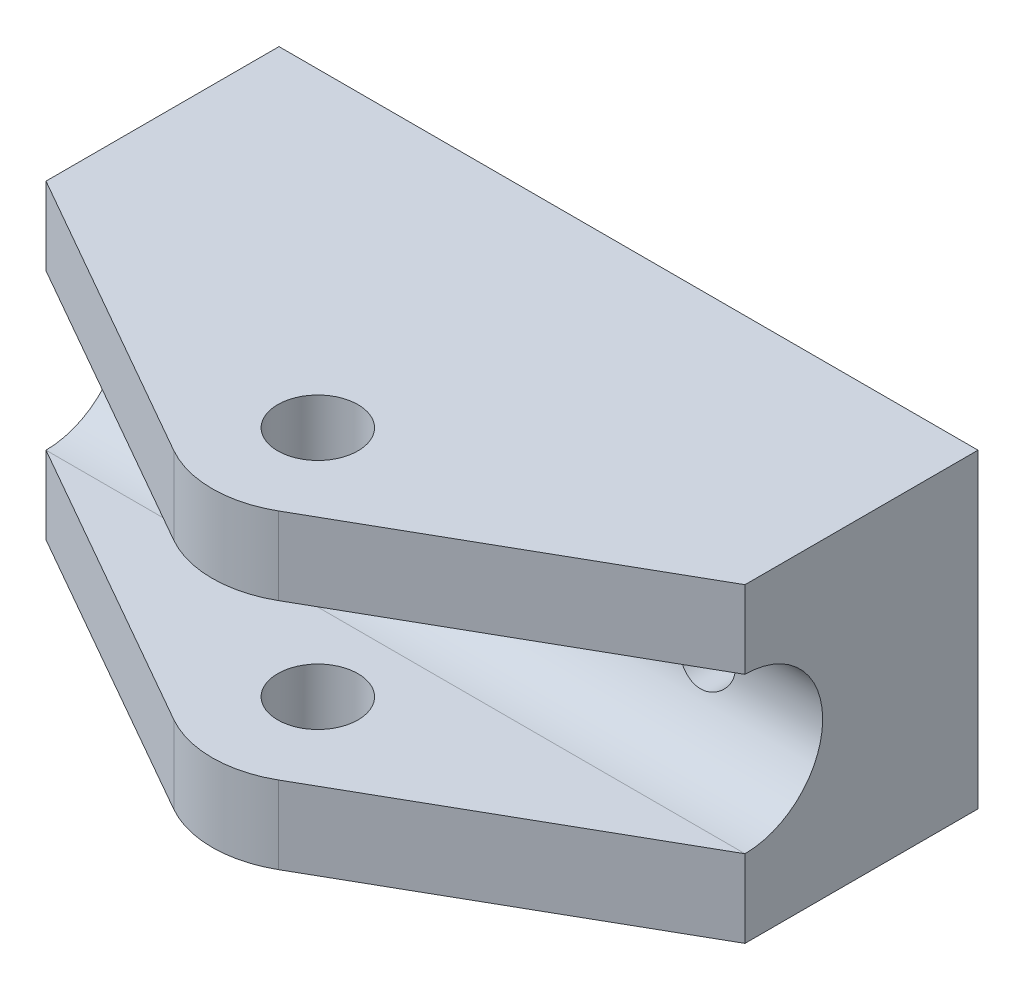
ISO-10303-21;
HEADER;
FILE_DESCRIPTION(('STEP AP214'),'2;1');
FILE_NAME('part.step','',(''),(''),'','','');
FILE_SCHEMA(('AUTOMOTIVE_DESIGN { 1 0 10303 214 1 1 1 1 }'));
ENDSEC;
DATA;
#1=APPLICATION_CONTEXT('core data for automotive mechanical design processes');
#2=APPLICATION_PROTOCOL_DEFINITION('international standard','automotive_design',2000,#1);
#3=PRODUCT_CONTEXT('',#1,'mechanical');
#4=PRODUCT('Part','Part','',(#3));
#5=PRODUCT_RELATED_PRODUCT_CATEGORY('part','',(#4));
#6=PRODUCT_DEFINITION_FORMATION('','',#4);
#7=PRODUCT_DEFINITION_CONTEXT('part definition',#1,'design');
#8=PRODUCT_DEFINITION('design','',#6,#7);
#9=PRODUCT_DEFINITION_SHAPE('','',#8);
#10=(LENGTH_UNIT() NAMED_UNIT(*) SI_UNIT(.MILLI.,.METRE.));
#11=(NAMED_UNIT(*) PLANE_ANGLE_UNIT() SI_UNIT($,.RADIAN.));
#12=(NAMED_UNIT(*) SI_UNIT($,.STERADIAN.) SOLID_ANGLE_UNIT());
#13=UNCERTAINTY_MEASURE_WITH_UNIT(LENGTH_MEASURE(1.E-05),#10,'distance_accuracy_value','');
#14=(GEOMETRIC_REPRESENTATION_CONTEXT(3) GLOBAL_UNCERTAINTY_ASSIGNED_CONTEXT((#13)) GLOBAL_UNIT_ASSIGNED_CONTEXT((#10,
#11,#12)) REPRESENTATION_CONTEXT('',''));
#15=CARTESIAN_POINT('',(0.,0.,0.));
#16=DIRECTION('',(0.,0.,1.));
#17=DIRECTION('',(1.,0.,0.));
#18=AXIS2_PLACEMENT_3D('',#15,#16,#17);
#19=CARTESIAN_POINT('',(226.355780426746,228.6,25.3999999999998));
#20=DIRECTION('',(0.,1.,0.));
#21=DIRECTION('',(-1.,0.,0.));
#22=AXIS2_PLACEMENT_3D('',#19,#20,#21);
#23=CYLINDRICAL_SURFACE('',#22,8.636);
#24=DIRECTION('',(0.,1.,0.));
#25=VECTOR('',#24,1.);
#26=CARTESIAN_POINT('',(222.078587653626,228.6,32.9024074790401));
#27=LINE('',#26,#25);
#28=CARTESIAN_POINT('',(222.078587653626,247.65,32.9024074790389));
#29=VERTEX_POINT('',#28);
#30=CARTESIAN_POINT('',(222.078587653626,254.,32.9024074790401));
#31=VERTEX_POINT('',#30);
#32=EDGE_CURVE('E179',#29,#31,#27,.T.);
#33=ORIENTED_EDGE('',*,*,#32,.F.);
#34=CARTESIAN_POINT('',(226.355780426746,247.65,25.3999999999998));
#35=DIRECTION('',(0.,1.,0.));
#36=DIRECTION('',(-1.,0.,0.));
#37=AXIS2_PLACEMENT_3D('',#34,#35,#36);
#38=CIRCLE('',#37,8.636);
#39=CARTESIAN_POINT('',(230.632973199866,247.65,32.9024074790407));
#40=VERTEX_POINT('',#39);
#41=EDGE_CURVE('E213',#29,#40,#38,.T.);
#42=ORIENTED_EDGE('',*,*,#41,.T.);
#43=DIRECTION('',(0.,1.,0.));
#44=VECTOR('',#43,1.);
#45=CARTESIAN_POINT('',(230.632973199866,228.6,32.9024074790407));
#46=LINE('',#45,#44);
#47=CARTESIAN_POINT('',(230.632973199866,254.,32.9024074790407));
#48=VERTEX_POINT('',#47);
#49=EDGE_CURVE('E181',#40,#48,#46,.T.);
#50=ORIENTED_EDGE('',*,*,#49,.T.);
#51=CARTESIAN_POINT('',(226.355780426746,254.,25.3999999999998));
#52=DIRECTION('',(0.,1.,0.));
#53=DIRECTION('',(0.,0.,1.));
#54=AXIS2_PLACEMENT_3D('',#51,#52,#53);
#55=CIRCLE('',#54,8.636);
#56=EDGE_CURVE('E291',#48,#31,#55,.F.);
#57=ORIENTED_EDGE('',*,*,#56,.T.);
#58=EDGE_LOOP('',(#33,#42,#50,#57));
#59=FACE_BOUND('',#58,.T.);
#60=ADVANCED_FACE('F57',(#59),#23,.T.);
#61=CARTESIAN_POINT('',(70.7302904739295,228.6,124.064424587359));
#62=DIRECTION('',(-0.495274753719334,0.,-0.868736391737018));
#63=DIRECTION('',(-0.868736391737018,0.,0.495274753719334));
#64=AXIS2_PLACEMENT_3D('',#61,#62,#63);
#65=PLANE('',#64);
#66=ORIENTED_EDGE('',*,*,#49,.F.);
#67=DIRECTION('',(0.868736391737018,0.,-0.495274753719334));
#68=VECTOR('',#67,1.);
#69=CARTESIAN_POINT('',(70.7302904739295,247.65,124.064424587359));
#70=LINE('',#69,#68);
#71=CARTESIAN_POINT('',(254.930780426748,247.65,19.049999999999));
#72=VERTEX_POINT('',#71);
#73=EDGE_CURVE('E216',#40,#72,#70,.T.);
#74=ORIENTED_EDGE('',*,*,#73,.T.);
#75=DIRECTION('',(0.,1.,0.));
#76=VECTOR('',#75,1.);
#77=CARTESIAN_POINT('',(254.930780426746,228.6,19.0499999999999));
#78=LINE('',#77,#76);
#79=CARTESIAN_POINT('',(254.930780426746,254.,19.0499999999999));
#80=VERTEX_POINT('',#79);
#81=EDGE_CURVE('E160',#72,#80,#78,.T.);
#82=ORIENTED_EDGE('',*,*,#81,.T.);
#83=DIRECTION('',(-0.868736391737016,0.,0.495274753719333));
#84=VECTOR('',#83,1.);
#85=CARTESIAN_POINT('',(70.7302904739295,254.,124.064424587359));
#86=LINE('',#85,#84);
#87=EDGE_CURVE('E301',#80,#48,#86,.T.);
#88=ORIENTED_EDGE('',*,*,#87,.T.);
#89=EDGE_LOOP('',(#66,#74,#82,#88));
#90=FACE_BOUND('',#89,.T.);
#91=ADVANCED_FACE('F254',(#90),#65,.F.);
#92=CARTESIAN_POINT('',(40.3185342424921,228.6,-70.7207013782029));
#93=DIRECTION('',(-0.495274753719335,0.,0.868736391737017));
#94=DIRECTION('',(0.868736391737017,0.,0.495274753719335));
#95=AXIS2_PLACEMENT_3D('',#92,#93,#94);
#96=PLANE('',#95);
#97=DIRECTION('',(-0.868736391737017,0.,-0.495274753719335));
#98=VECTOR('',#97,1.);
#99=CARTESIAN_POINT('',(40.3185342424921,247.65,-70.7207013782029));
#100=LINE('',#99,#98);
#101=CARTESIAN_POINT('',(197.780780426748,247.65,19.049999999999));
#102=VERTEX_POINT('',#101);
#103=EDGE_CURVE('E211',#29,#102,#100,.T.);
#104=ORIENTED_EDGE('',*,*,#103,.F.);
#105=ORIENTED_EDGE('',*,*,#32,.T.);
#106=DIRECTION('',(0.868736391737016,0.,0.495274753719334));
#107=VECTOR('',#106,1.);
#108=CARTESIAN_POINT('',(40.3185342424921,254.,-70.7207013782029));
#109=LINE('',#108,#107);
#110=CARTESIAN_POINT('',(197.780780426747,254.,19.049999999999));
#111=VERTEX_POINT('',#110);
#112=EDGE_CURVE('E171',#111,#31,#109,.T.);
#113=ORIENTED_EDGE('',*,*,#112,.F.);
#114=DIRECTION('',(0.,1.,0.));
#115=VECTOR('',#114,1.);
#116=CARTESIAN_POINT('',(197.780780426747,228.6,19.049999999999));
#117=LINE('',#116,#115);
#118=EDGE_CURVE('E175',#102,#111,#117,.T.);
#119=ORIENTED_EDGE('',*,*,#118,.F.);
#120=EDGE_LOOP('',(#104,#105,#113,#119));
#121=FACE_BOUND('',#120,.T.);
#122=ADVANCED_FACE('F246',(#121),#96,.T.);
#123=CARTESIAN_POINT('',(226.355780426745,228.6,25.3999999999994));
#124=DIRECTION('',(0.,1.,0.));
#125=DIRECTION('',(-1.,0.,0.));
#126=AXIS2_PLACEMENT_3D('',#123,#124,#125);
#127=CYLINDRICAL_SURFACE('',#126,3.28144717642097);
#128=CARTESIAN_POINT('',(226.355780426745,247.65,25.3999999999994));
#129=DIRECTION('',(0.,1.,0.));
#130=DIRECTION('',(-1.,0.,0.));
#131=AXIS2_PLACEMENT_3D('',#128,#129,#130);
#132=CIRCLE('',#131,3.28144717642097);
#133=CARTESIAN_POINT('',(223.074333250324,247.65,25.3999999999994));
#134=VERTEX_POINT('',#133);
#135=EDGE_CURVE('E62',#134,#134,#132,.F.);
#136=ORIENTED_EDGE('',*,*,#135,.T.);
#137=EDGE_LOOP('',(#136));
#138=FACE_BOUND('',#137,.T.);
#139=CARTESIAN_POINT('',(226.355780426745,254.,25.3999999999994));
#140=DIRECTION('',(0.,1.,0.));
#141=DIRECTION('',(0.,0.,1.));
#142=AXIS2_PLACEMENT_3D('',#139,#140,#141);
#143=CIRCLE('',#142,3.28144717642097);
#144=CARTESIAN_POINT('',(226.355780426745,254.,28.6814471764203));
#145=VERTEX_POINT('',#144);
#146=EDGE_CURVE('E313',#145,#145,#143,.T.);
#147=ORIENTED_EDGE('',*,*,#146,.T.);
#148=EDGE_LOOP('',(#147));
#149=FACE_BOUND('',#148,.T.);
#150=ADVANCED_FACE('F242',(#138,#149),#127,.F.);
#151=CARTESIAN_POINT('',(0.,254.,34.036));
#152=DIRECTION('',(0.,-1.,0.));
#153=DIRECTION('',(1.,0.,0.));
#154=AXIS2_PLACEMENT_3D('',#151,#152,#153);
#155=PLANE('',#154);
#156=ORIENTED_EDGE('',*,*,#56,.F.);
#157=ORIENTED_EDGE('',*,*,#87,.F.);
#158=DIRECTION('',(0.,0.,-1.));
#159=VECTOR('',#158,1.);
#160=CARTESIAN_POINT('',(254.930780426748,254.,34.036));
#161=LINE('',#160,#159);
#162=CARTESIAN_POINT('',(254.930780426748,254.,0.));
#163=VERTEX_POINT('',#162);
#164=EDGE_CURVE('E197',#80,#163,#161,.T.);
#165=ORIENTED_EDGE('',*,*,#164,.T.);
#166=DIRECTION('',(-1.,0.,0.));
#167=VECTOR('',#166,1.);
#168=CARTESIAN_POINT('',(0.,254.,0.));
#169=LINE('',#168,#167);
#170=CARTESIAN_POINT('',(197.780780426748,254.,0.));
#171=VERTEX_POINT('',#170);
#172=EDGE_CURVE('E185',#163,#171,#169,.T.);
#173=ORIENTED_EDGE('',*,*,#172,.T.);
#174=DIRECTION('',(0.,0.,-1.));
#175=VECTOR('',#174,1.);
#176=CARTESIAN_POINT('',(197.780780426748,254.,34.036));
#177=LINE('',#176,#175);
#178=EDGE_CURVE('E12',#111,#171,#177,.T.);
#179=ORIENTED_EDGE('',*,*,#178,.F.);
#180=ORIENTED_EDGE('',*,*,#112,.T.);
#181=EDGE_LOOP('',(#156,#157,#165,#173,#179,#180));
#182=FACE_BOUND('',#181,.T.);
#183=ORIENTED_EDGE('',*,*,#146,.F.);
#184=EDGE_LOOP('',(#183));
#185=FACE_BOUND('',#184,.T.);
#186=ADVANCED_FACE('F268',(#182,#185),#155,.F.);
#187=CARTESIAN_POINT('',(197.780780426748,0.,34.036));
#188=DIRECTION('',(1.,0.,0.));
#189=DIRECTION('',(0.,1.,0.));
#190=AXIS2_PLACEMENT_3D('',#187,#188,#189);
#191=PLANE('',#190);
#192=CARTESIAN_POINT('',(197.780780426747,228.6,19.049999999999));
#193=VERTEX_POINT('',#192);
#194=CARTESIAN_POINT('',(197.780780426747,234.95,19.049999999999));
#195=VERTEX_POINT('',#194);
#196=EDGE_CURVE('E168',#193,#195,#117,.T.);
#197=ORIENTED_EDGE('',*,*,#196,.T.);
#198=CARTESIAN_POINT('',(197.780780426748,241.3,19.049999999999));
#199=DIRECTION('',(-1.,0.,0.));
#200=DIRECTION('',(0.,-1.,0.));
#201=AXIS2_PLACEMENT_3D('',#198,#199,#200);
#202=CIRCLE('',#201,6.34999999999997);
#203=EDGE_CURVE('E75',#102,#195,#202,.T.);
#204=ORIENTED_EDGE('',*,*,#203,.F.);
#205=ORIENTED_EDGE('',*,*,#118,.T.);
#206=ORIENTED_EDGE('',*,*,#178,.T.);
#207=DIRECTION('',(0.,-1.,0.));
#208=VECTOR('',#207,1.);
#209=CARTESIAN_POINT('',(197.780780426748,0.,0.));
#210=LINE('',#209,#208);
#211=CARTESIAN_POINT('',(197.780780426748,228.6,0.));
#212=VERTEX_POINT('',#211);
#213=EDGE_CURVE('E188',#171,#212,#210,.T.);
#214=ORIENTED_EDGE('',*,*,#213,.T.);
#215=DIRECTION('',(0.,0.,-1.));
#216=VECTOR('',#215,1.);
#217=CARTESIAN_POINT('',(197.780780426748,228.6,34.036));
#218=LINE('',#217,#216);
#219=EDGE_CURVE('E67',#193,#212,#218,.T.);
#220=ORIENTED_EDGE('',*,*,#219,.F.);
#221=EDGE_LOOP('',(#197,#204,#205,#206,#214,#220));
#222=FACE_BOUND('',#221,.T.);
#223=ADVANCED_FACE('F264',(#222),#191,.F.);
#224=CARTESIAN_POINT('',(-5.55111512312578E-13,228.6,34.036));
#225=DIRECTION('',(0.,-1.,0.));
#226=DIRECTION('',(1.,0.,0.));
#227=AXIS2_PLACEMENT_3D('',#224,#225,#226);
#228=PLANE('',#227);
#229=DIRECTION('',(-0.868736391737016,0.,0.495274753719333));
#230=VECTOR('',#229,1.);
#231=CARTESIAN_POINT('',(70.7302904739295,228.6,124.064424587359));
#232=LINE('',#231,#230);
#233=CARTESIAN_POINT('',(254.930780426748,228.6,19.049999999999));
#234=VERTEX_POINT('',#233);
#235=CARTESIAN_POINT('',(230.632973199866,228.6,32.9024074790407));
#236=VERTEX_POINT('',#235);
#237=EDGE_CURVE('E83',#234,#236,#232,.T.);
#238=ORIENTED_EDGE('',*,*,#237,.T.);
#239=CARTESIAN_POINT('',(226.355780426746,228.6,25.3999999999998));
#240=DIRECTION('',(0.,1.,0.));
#241=DIRECTION('',(0.,0.,1.));
#242=AXIS2_PLACEMENT_3D('',#239,#240,#241);
#243=CIRCLE('',#242,8.636);
#244=CARTESIAN_POINT('',(222.078587653626,228.6,32.9024074790401));
#245=VERTEX_POINT('',#244);
#246=EDGE_CURVE('E303',#236,#245,#243,.F.);
#247=ORIENTED_EDGE('',*,*,#246,.T.);
#248=DIRECTION('',(0.868736391737016,0.,0.495274753719334));
#249=VECTOR('',#248,1.);
#250=CARTESIAN_POINT('',(40.3185342424921,228.6,-70.7207013782029));
#251=LINE('',#250,#249);
#252=EDGE_CURVE('E302',#193,#245,#251,.T.);
#253=ORIENTED_EDGE('',*,*,#252,.F.);
#254=ORIENTED_EDGE('',*,*,#219,.T.);
#255=DIRECTION('',(-1.,0.,0.));
#256=VECTOR('',#255,1.);
#257=CARTESIAN_POINT('',(-5.55111512312578E-13,228.6,0.));
#258=LINE('',#257,#256);
#259=CARTESIAN_POINT('',(254.930780426748,228.6,0.));
#260=VERTEX_POINT('',#259);
#261=EDGE_CURVE('E191',#260,#212,#258,.T.);
#262=ORIENTED_EDGE('',*,*,#261,.F.);
#263=DIRECTION('',(0.,0.,-1.));
#264=VECTOR('',#263,1.);
#265=CARTESIAN_POINT('',(254.930780426748,228.6,34.036));
#266=LINE('',#265,#264);
#267=EDGE_CURVE('E199',#234,#260,#266,.T.);
#268=ORIENTED_EDGE('',*,*,#267,.F.);
#269=EDGE_LOOP('',(#238,#247,#253,#254,#262,#268));
#270=FACE_BOUND('',#269,.T.);
#271=CARTESIAN_POINT('',(226.355780426745,228.6,25.3999999999994));
#272=DIRECTION('',(0.,1.,0.));
#273=DIRECTION('',(0.,0.,1.));
#274=AXIS2_PLACEMENT_3D('',#271,#272,#273);
#275=CIRCLE('',#274,3.28144717642097);
#276=CARTESIAN_POINT('',(226.355780426745,228.6,28.6814471764203));
#277=VERTEX_POINT('',#276);
#278=EDGE_CURVE('E311',#277,#277,#275,.T.);
#279=ORIENTED_EDGE('',*,*,#278,.T.);
#280=EDGE_LOOP('',(#279));
#281=FACE_BOUND('',#280,.T.);
#282=ADVANCED_FACE('F260',(#270,#281),#228,.T.);
#283=CARTESIAN_POINT('',(207.305780426748,241.3,34.036));
#284=DIRECTION('',(0.,0.,-1.));
#285=DIRECTION('',(-1.,0.,0.));
#286=AXIS2_PLACEMENT_3D('',#283,#284,#285);
#287=CYLINDRICAL_SURFACE('',#286,2.38125);
#288=CARTESIAN_POINT('',(204.924530426748,241.3,12.6999999999991));
#289=CARTESIAN_POINT('',(204.924525819342,241.428960656064,12.6999965478827));
#290=CARTESIAN_POINT('',(204.935039296142,241.557889758829,12.7039627288785));
#291=CARTESIAN_POINT('',(204.976645186739,241.811894855609,12.7193882008891));
#292=CARTESIAN_POINT('',(205.007734636245,241.93697140193,12.7308464125569));
#293=CARTESIAN_POINT('',(205.08923831706,242.179571496173,12.7600260357833));
#294=CARTESIAN_POINT('',(205.139615272202,242.297109105858,12.7777353609517));
#295=CARTESIAN_POINT('',(205.25807435741,242.522056404879,12.8176533117241));
#296=CARTESIAN_POINT('',(205.326161236299,242.629463367195,12.8398631437618));
#297=CARTESIAN_POINT('',(205.481127819823,242.83566243706,12.887543329331));
#298=CARTESIAN_POINT('',(205.568627218085,242.933967284115,12.913105958985));
#299=CARTESIAN_POINT('',(205.758619491769,243.114900190906,12.9641564936668));
#300=CARTESIAN_POINT('',(205.861116939537,243.197523452202,12.9896443734805));
#301=CARTESIAN_POINT('',(206.082956906441,243.347846460179,13.0387332789426));
#302=CARTESIAN_POINT('',(206.202792358639,243.414857866983,13.0622254499686));
#303=CARTESIAN_POINT('',(206.45305218899,243.527558510554,13.1032272187298));
#304=CARTESIAN_POINT('',(206.583472313257,243.57325626376,13.120739205257));
#305=CARTESIAN_POINT('',(206.845590751908,243.640108842404,13.1468111964159));
#306=CARTESIAN_POINT('',(206.977017175264,243.662193542345,13.1557089509296));
#307=CARTESIAN_POINT('',(207.241988577563,243.68410045994,13.1645332743023));
#308=CARTESIAN_POINT('',(207.375532658774,243.683931871742,13.1644635481576));
#309=CARTESIAN_POINT('',(207.632439548023,243.662048070059,13.1556520028402));
#310=CARTESIAN_POINT('',(207.755933365093,243.641622960081,13.14742943167));
#311=CARTESIAN_POINT('',(207.997592528016,243.58193866491,13.1241016083041));
#312=CARTESIAN_POINT('',(208.115757068497,243.542676643404,13.1089953196297));
#313=CARTESIAN_POINT('',(208.346032771766,243.445724508579,13.0732894777288));
#314=CARTESIAN_POINT('',(208.457987110965,243.387699798702,13.052591401937));
#315=CARTESIAN_POINT('',(208.670944285173,243.255102670983,13.0080669140374));
#316=CARTESIAN_POINT('',(208.77194332106,243.180524539821,12.9842394229917));
#317=CARTESIAN_POINT('',(208.967263742794,243.011035769669,12.9341873831107));
#318=CARTESIAN_POINT('',(209.060680143935,242.915095492132,12.9079093591403));
#319=CARTESIAN_POINT('',(209.230366948099,242.708608737925,12.8572938153942));
#320=CARTESIAN_POINT('',(209.306634715934,242.598060020552,12.8329565942271));
#321=CARTESIAN_POINT('',(209.440857432085,242.363185956226,12.7884809824049));
#322=CARTESIAN_POINT('',(209.498510961936,242.238674008229,12.7684133401277));
#323=CARTESIAN_POINT('',(209.591752811026,241.980778500208,12.7352628465586));
#324=CARTESIAN_POINT('',(209.627350930539,241.847398909718,12.7221768933279));
#325=CARTESIAN_POINT('',(209.673731601971,241.583170698499,12.7050094637535));
#326=CARTESIAN_POINT('',(209.68573281438,241.452564496055,12.7004862667163));
#327=CARTESIAN_POINT('',(209.688127490689,241.191141195533,12.6995889375096));
#328=CARTESIAN_POINT('',(209.678525745251,241.060324150639,12.7032129986076));
#329=CARTESIAN_POINT('',(209.638913234583,240.807458997908,12.7179116073584));
#330=CARTESIAN_POINT('',(209.609700851065,240.685267091788,12.7286945234725));
#331=CARTESIAN_POINT('',(209.532747536579,240.447604964005,12.7563328011681));
#332=CARTESIAN_POINT('',(209.485004195755,240.332135618823,12.7731889525218));
#333=CARTESIAN_POINT('',(209.370821997,240.107394172888,12.8119247125271));
#334=CARTESIAN_POINT('',(209.303875031606,239.998403854852,12.8339373716757));
#335=CARTESIAN_POINT('',(209.153760437963,239.792839070134,12.88055158891));
#336=CARTESIAN_POINT('',(209.070586821332,239.696269209071,12.905154101223));
#337=CARTESIAN_POINT('',(208.884701382876,239.512426106993,12.9560108943296));
#338=CARTESIAN_POINT('',(208.781135961596,239.426017303288,12.9822781930024));
#339=CARTESIAN_POINT('',(208.560458853524,239.271634580744,13.0321238000178));
#340=CARTESIAN_POINT('',(208.443345951669,239.203662317295,13.055701866788));
#341=CARTESIAN_POINT('',(208.197930047747,239.088012845386,13.0974015765675));
#342=CARTESIAN_POINT('',(208.069582642615,239.04042099353,13.1155001797842));
#343=CARTESIAN_POINT('',(207.805827426893,238.967837349963,13.1436422278544));
#344=CARTESIAN_POINT('',(207.670424039283,238.9428315764,13.1536906557114));
#345=CARTESIAN_POINT('',(207.405767273476,238.917379239822,13.163932670167));
#346=CARTESIAN_POINT('',(207.276677373897,238.915458612504,13.164717693191));
#347=CARTESIAN_POINT('',(207.020117237159,238.93245463919,13.1578601976675));
#348=CARTESIAN_POINT('',(206.892646847582,238.951369317379,13.150218478229));
#349=CARTESIAN_POINT('',(206.646892954335,239.00835142687,13.1278607523303));
#350=CARTESIAN_POINT('',(206.528447802083,239.045816701725,13.1133677696445));
#351=CARTESIAN_POINT('',(206.299455432013,239.138306063619,13.0790704207708));
#352=CARTESIAN_POINT('',(206.188910219436,239.193334589499,13.059264712075));
#353=CARTESIAN_POINT('',(205.972555398103,239.322735794482,13.0152818830236));
#354=CARTESIAN_POINT('',(205.867297786828,239.397971279252,12.9909300372488));
#355=CARTESIAN_POINT('',(205.670430698706,239.564315039038,12.9412008327289));
#356=CARTESIAN_POINT('',(205.578825576774,239.655428358797,12.9158231500266));
#357=CARTESIAN_POINT('',(205.406809821881,239.856834870104,12.8652520093172));
#358=CARTESIAN_POINT('',(205.32727321817,239.967899152312,12.8401428347013));
#359=CARTESIAN_POINT('',(205.188019461496,240.202699008169,12.7943845829937));
#360=CARTESIAN_POINT('',(205.128303851216,240.326435567131,12.7737358531056));
#361=CARTESIAN_POINT('',(205.028707210634,240.588801457321,12.738508104868));
#362=CARTESIAN_POINT('',(204.989797211692,240.727843692203,12.7242306926102));
#363=CARTESIAN_POINT('',(204.937717852874,241.0112722729,12.7049809053981));
#364=CARTESIAN_POINT('',(204.924535583762,241.155655901521,12.7000038639111));
#365=CARTESIAN_POINT('',(204.924530426748,241.3,12.6999999999991));
#366=B_SPLINE_CURVE_WITH_KNOTS('',3,(#288,#289,#290,#291,#292,#293,#294,#295,#296,#297,#298,
#299,#300,#301,#302,#303,#304,#305,#306,#307,#308,#309,#310,#311,#312,#313,#314,#315,#316,#317,
#318,#319,#320,#321,#322,#323,#324,#325,#326,#327,#328,#329,#330,#331,#332,#333,#334,#335,#336,
#337,#338,#339,#340,#341,#342,#343,#344,#345,#346,#347,#348,#349,#350,#351,#352,#353,#354,#355,
#356,#357,#358,#359,#360,#361,#362,#363,#364,#365),.UNSPECIFIED.,.T.,.F.,(4,2,2,2,2,2,2,2,2,2,2,
2,2,2,2,2,2,2,2,2,2,2,2,2,2,2,2,2,2,2,2,2,2,2,2,2,2,2,4),(0.,0.386349559977377,
0.772643472379596,1.15819454862653,1.54384911513007,1.94426869500062,2.34481060319427,
2.76060970771384,3.17624252596514,3.57482575636831,3.97324430901538,4.34781872877954,
4.72244956671184,5.10416823314389,5.48601885306511,5.89353268420603,6.30110909424293,
6.71498808266645,7.12868303271918,7.5203846867203,7.91199948569952,8.28856670204097,
8.66518290541448,9.05286514702115,9.44069073281543,9.85101724635859,10.2613805903573,
10.6734461842944,11.0852565149346,11.470620370249,11.8559476846037,12.2295148860212,
12.603176575672,12.9964254911628,13.3897995792034,13.8044607332579,14.219154153156,
14.6518076761337,15.0842440535135),.UNSPECIFIED.);
#367=CARTESIAN_POINT('',(204.924530426748,241.3,12.6999999999991));
#368=VERTEX_POINT('',#367);
#369=EDGE_CURVE('E225',#368,#368,#366,.T.);
#370=ORIENTED_EDGE('',*,*,#369,.F.);
#371=EDGE_LOOP('',(#370));
#372=FACE_BOUND('',#371,.T.);
#373=CARTESIAN_POINT('',(207.305780426748,241.3,0.));
#374=DIRECTION('',(0.,0.,1.));
#375=DIRECTION('',(1.,0.,0.));
#376=AXIS2_PLACEMENT_3D('',#373,#374,#375);
#377=CIRCLE('',#376,2.38125);
#378=CARTESIAN_POINT('',(209.687030426748,241.3,0.));
#379=VERTEX_POINT('',#378);
#380=EDGE_CURVE('E166',#379,#379,#377,.T.);
#381=ORIENTED_EDGE('',*,*,#380,.F.);
#382=EDGE_LOOP('',(#381));
#383=FACE_BOUND('',#382,.T.);
#384=ADVANCED_FACE('F263',(#372,#383),#287,.F.);
#385=CARTESIAN_POINT('',(245.405780426748,241.3,34.036));
#386=DIRECTION('',(0.,0.,-1.));
#387=DIRECTION('',(-1.,0.,0.));
#388=AXIS2_PLACEMENT_3D('',#385,#386,#387);
#389=CYLINDRICAL_SURFACE('',#388,2.38125000000003);
#390=CARTESIAN_POINT('',(243.024530426748,241.3,12.6999999999991));
#391=CARTESIAN_POINT('',(243.024525819342,241.428960656064,12.6999965478827));
#392=CARTESIAN_POINT('',(243.035039296142,241.557889758828,12.7039627288785));
#393=CARTESIAN_POINT('',(243.076645186739,241.811894855609,12.7193882008891));
#394=CARTESIAN_POINT('',(243.107734636245,241.93697140193,12.7308464125569));
#395=CARTESIAN_POINT('',(243.189238317061,242.179571496173,12.7600260357833));
#396=CARTESIAN_POINT('',(243.239615272202,242.297109105857,12.7777353609517));
#397=CARTESIAN_POINT('',(243.35807435741,242.522056404879,12.817653311724));
#398=CARTESIAN_POINT('',(243.426161236299,242.629463367195,12.8398631437617));
#399=CARTESIAN_POINT('',(243.581127819823,242.83566243706,12.887543329331));
#400=CARTESIAN_POINT('',(243.668627218085,242.933967284115,12.9131059589849));
#401=CARTESIAN_POINT('',(243.858619491769,243.114900190905,12.9641564936667));
#402=CARTESIAN_POINT('',(243.961116939537,243.197523452202,12.9896443734804));
#403=CARTESIAN_POINT('',(244.182956906441,243.347846460179,13.0387332789425));
#404=CARTESIAN_POINT('',(244.302792358639,243.414857866982,13.0622254499685));
#405=CARTESIAN_POINT('',(244.55305218899,243.527558510553,13.1032272187297));
#406=CARTESIAN_POINT('',(244.683472313257,243.573256263759,13.1207392052569));
#407=CARTESIAN_POINT('',(244.945590751908,243.640108842403,13.1468111964158));
#408=CARTESIAN_POINT('',(245.077017175264,243.662193542344,13.1557089509295));
#409=CARTESIAN_POINT('',(245.341988577563,243.68410045994,13.1645332743022));
#410=CARTESIAN_POINT('',(245.475532658774,243.683931871742,13.1644635481575));
#411=CARTESIAN_POINT('',(245.732439548023,243.662048070059,13.1556520028401));
#412=CARTESIAN_POINT('',(245.855933365093,243.64162296008,13.1474294316699));
#413=CARTESIAN_POINT('',(246.097592528016,243.58193866491,13.124101608304));
#414=CARTESIAN_POINT('',(246.215757068497,243.542676643404,13.1089953196296));
#415=CARTESIAN_POINT('',(246.446032771766,243.445724508579,13.0732894777287));
#416=CARTESIAN_POINT('',(246.557987110965,243.387699798701,13.0525914019369));
#417=CARTESIAN_POINT('',(246.770944285174,243.255102670983,13.0080669140373));
#418=CARTESIAN_POINT('',(246.87194332106,243.180524539821,12.9842394229916));
#419=CARTESIAN_POINT('',(247.067263742794,243.011035769669,12.9341873831106));
#420=CARTESIAN_POINT('',(247.160680143936,242.915095492131,12.9079093591403));
#421=CARTESIAN_POINT('',(247.3303669481,242.708608737925,12.8572938153942));
#422=CARTESIAN_POINT('',(247.406634715934,242.598060020552,12.832956594227));
#423=CARTESIAN_POINT('',(247.540857432085,242.363185956225,12.7884809824049));
#424=CARTESIAN_POINT('',(247.598510961936,242.238674008228,12.7684133401276));
#425=CARTESIAN_POINT('',(247.691752811027,241.980778500208,12.7352628465585));
#426=CARTESIAN_POINT('',(247.727350930539,241.847398909717,12.7221768933278));
#427=CARTESIAN_POINT('',(247.773731601971,241.583170698498,12.7050094637535));
#428=CARTESIAN_POINT('',(247.78573281438,241.452564496055,12.7004862667163));
#429=CARTESIAN_POINT('',(247.788127490689,241.191141195532,12.6995889375096));
#430=CARTESIAN_POINT('',(247.778525745251,241.060324150639,12.7032129986076));
#431=CARTESIAN_POINT('',(247.738913234583,240.807458997908,12.7179116073584));
#432=CARTESIAN_POINT('',(247.709700851065,240.685267091788,12.7286945234725));
#433=CARTESIAN_POINT('',(247.632747536579,240.447604964005,12.7563328011681));
#434=CARTESIAN_POINT('',(247.585004195755,240.332135618823,12.7731889525219));
#435=CARTESIAN_POINT('',(247.470821997,240.107394172887,12.8119247125272));
#436=CARTESIAN_POINT('',(247.403875031606,239.998403854852,12.8339373716757));
#437=CARTESIAN_POINT('',(247.253760437963,239.792839070134,12.8805515889101));
#438=CARTESIAN_POINT('',(247.170586821333,239.69626920907,12.9051541012231));
#439=CARTESIAN_POINT('',(246.984701382876,239.512426106993,12.9560108943297));
#440=CARTESIAN_POINT('',(246.881135961596,239.426017303288,12.9822781930024));
#441=CARTESIAN_POINT('',(246.660458853525,239.271634580743,13.0321238000178));
#442=CARTESIAN_POINT('',(246.543345951669,239.203662317294,13.0557018667881));
#443=CARTESIAN_POINT('',(246.297930047747,239.088012845386,13.0974015765676));
#444=CARTESIAN_POINT('',(246.169582642615,239.04042099353,13.1155001797843));
#445=CARTESIAN_POINT('',(245.905827426894,238.967837349963,13.1436422278545));
#446=CARTESIAN_POINT('',(245.770424039283,238.942831576399,13.1536906557115));
#447=CARTESIAN_POINT('',(245.505767273476,238.917379239822,13.1639326701671));
#448=CARTESIAN_POINT('',(245.376677373897,238.915458612503,13.1647176931911));
#449=CARTESIAN_POINT('',(245.12011723716,238.932454639189,13.1578601976677));
#450=CARTESIAN_POINT('',(244.992646847582,238.951369317379,13.1502184782292));
#451=CARTESIAN_POINT('',(244.746892954335,239.00835142687,13.1278607523304));
#452=CARTESIAN_POINT('',(244.628447802083,239.045816701725,13.1133677696447));
#453=CARTESIAN_POINT('',(244.399455432013,239.138306063619,13.0790704207709));
#454=CARTESIAN_POINT('',(244.288910219437,239.193334589499,13.0592647120751));
#455=CARTESIAN_POINT('',(244.072555398103,239.322735794482,13.0152818830237));
#456=CARTESIAN_POINT('',(243.967297786828,239.397971279252,12.9909300372489));
#457=CARTESIAN_POINT('',(243.770430698706,239.564315039037,12.941200832729));
#458=CARTESIAN_POINT('',(243.678825576774,239.655428358796,12.9158231500267));
#459=CARTESIAN_POINT('',(243.506809821881,239.856834870104,12.8652520093173));
#460=CARTESIAN_POINT('',(243.42727321817,239.967899152312,12.8401428347014));
#461=CARTESIAN_POINT('',(243.288019461496,240.202699008168,12.7943845829938));
#462=CARTESIAN_POINT('',(243.228303851216,240.326435567131,12.7737358531056));
#463=CARTESIAN_POINT('',(243.128707210634,240.588801457321,12.7385081048681));
#464=CARTESIAN_POINT('',(243.089797211692,240.727843692203,12.7242306926102));
#465=CARTESIAN_POINT('',(243.037717852874,241.0112722729,12.7049809053981));
#466=CARTESIAN_POINT('',(243.024535583762,241.155655901521,12.7000038639111));
#467=CARTESIAN_POINT('',(243.024530426748,241.3,12.6999999999991));
#468=B_SPLINE_CURVE_WITH_KNOTS('',3,(#390,#391,#392,#393,#394,#395,#396,#397,#398,#399,#400,
#401,#402,#403,#404,#405,#406,#407,#408,#409,#410,#411,#412,#413,#414,#415,#416,#417,#418,#419,
#420,#421,#422,#423,#424,#425,#426,#427,#428,#429,#430,#431,#432,#433,#434,#435,#436,#437,#438,
#439,#440,#441,#442,#443,#444,#445,#446,#447,#448,#449,#450,#451,#452,#453,#454,#455,#456,#457,
#458,#459,#460,#461,#462,#463,#464,#465,#466,#467),.UNSPECIFIED.,.T.,.F.,(4,2,2,2,2,2,2,2,2,2,2,
2,2,2,2,2,2,2,2,2,2,2,2,2,2,2,2,2,2,2,2,2,2,2,2,2,2,2,4),(0.,0.386349559977377,
0.772643472379594,1.15819454862652,1.54384911513006,1.94426869500065,2.34481060319421,
2.76060970771385,3.17624252596514,3.57482575636835,3.97324430901538,4.34781872877957,
4.7224495667119,5.10416823314392,5.48601885306514,5.8935326842061,6.301109094243,
6.71498808266655,7.12868303271924,7.52038468672036,7.91199948569955,8.28856670204101,
8.66518290541454,9.05286514702122,9.44069073281547,9.85101724635861,10.2613805903573,
10.6734461842945,11.0852565149347,11.4706203702491,11.8559476846038,12.2295148860213,
12.6031765756722,12.996425491163,13.3897995792035,13.804460733258,14.2191541531561,
14.6518076761338,15.0842440535137),.UNSPECIFIED.);
#469=CARTESIAN_POINT('',(243.024530426748,241.3,12.6999999999991));
#470=VERTEX_POINT('',#469);
#471=EDGE_CURVE('E218',#470,#470,#468,.T.);
#472=ORIENTED_EDGE('',*,*,#471,.F.);
#473=EDGE_LOOP('',(#472));
#474=FACE_BOUND('',#473,.T.);
#475=CARTESIAN_POINT('',(245.405780426748,241.3,0.));
#476=DIRECTION('',(0.,0.,1.));
#477=DIRECTION('',(1.,0.,0.));
#478=AXIS2_PLACEMENT_3D('',#475,#476,#477);
#479=CIRCLE('',#478,2.38125000000003);
#480=CARTESIAN_POINT('',(247.787030426748,241.3,0.));
#481=VERTEX_POINT('',#480);
#482=EDGE_CURVE('E163',#481,#481,#479,.T.);
#483=ORIENTED_EDGE('',*,*,#482,.F.);
#484=EDGE_LOOP('',(#483));
#485=FACE_BOUND('',#484,.T.);
#486=ADVANCED_FACE('F59',(#474,#485),#389,.F.);
#487=CARTESIAN_POINT('',(254.930780426748,0.,34.036));
#488=DIRECTION('',(1.,0.,0.));
#489=DIRECTION('',(0.,1.,0.));
#490=AXIS2_PLACEMENT_3D('',#487,#488,#489);
#491=PLANE('',#490);
#492=CARTESIAN_POINT('',(254.930780426748,241.3,19.049999999999));
#493=DIRECTION('',(-1.,0.,0.));
#494=DIRECTION('',(0.,-1.,0.));
#495=AXIS2_PLACEMENT_3D('',#492,#493,#494);
#496=CIRCLE('',#495,6.34999999999997);
#497=CARTESIAN_POINT('',(254.930780426748,234.95,19.049999999999));
#498=VERTEX_POINT('',#497);
#499=EDGE_CURVE('E150',#72,#498,#496,.T.);
#500=ORIENTED_EDGE('',*,*,#499,.T.);
#501=EDGE_CURVE('E157',#234,#498,#78,.T.);
#502=ORIENTED_EDGE('',*,*,#501,.F.);
#503=ORIENTED_EDGE('',*,*,#267,.T.);
#504=DIRECTION('',(0.,-1.,0.));
#505=VECTOR('',#504,1.);
#506=CARTESIAN_POINT('',(254.930780426748,0.,0.));
#507=LINE('',#506,#505);
#508=EDGE_CURVE('E194',#163,#260,#507,.T.);
#509=ORIENTED_EDGE('',*,*,#508,.F.);
#510=ORIENTED_EDGE('',*,*,#164,.F.);
#511=ORIENTED_EDGE('',*,*,#81,.F.);
#512=EDGE_LOOP('',(#500,#502,#503,#509,#510,#511));
#513=FACE_BOUND('',#512,.T.);
#514=ADVANCED_FACE('F156',(#513),#491,.T.);
#515=CARTESIAN_POINT('',(0.,0.,0.));
#516=DIRECTION('',(0.,0.,1.));
#517=DIRECTION('',(1.,0.,0.));
#518=AXIS2_PLACEMENT_3D('',#515,#516,#517);
#519=PLANE('',#518);
#520=ORIENTED_EDGE('',*,*,#482,.T.);
#521=EDGE_LOOP('',(#520));
#522=FACE_BOUND('',#521,.T.);
#523=ORIENTED_EDGE('',*,*,#380,.T.);
#524=EDGE_LOOP('',(#523));
#525=FACE_BOUND('',#524,.T.);
#526=ORIENTED_EDGE('',*,*,#172,.F.);
#527=ORIENTED_EDGE('',*,*,#508,.T.);
#528=ORIENTED_EDGE('',*,*,#261,.T.);
#529=ORIENTED_EDGE('',*,*,#213,.F.);
#530=EDGE_LOOP('',(#526,#527,#528,#529));
#531=FACE_BOUND('',#530,.T.);
#532=ADVANCED_FACE('F250',(#522,#525,#531),#519,.F.);
#533=CARTESIAN_POINT('',(230.632973199866,234.95,32.9024074790407));
#534=VERTEX_POINT('',#533);
#535=EDGE_CURVE('E180',#236,#534,#46,.T.);
#536=ORIENTED_EDGE('',*,*,#535,.T.);
#537=CARTESIAN_POINT('',(226.355780426746,234.95,25.3999999999998));
#538=DIRECTION('',(0.,-1.,0.));
#539=DIRECTION('',(1.,0.,0.));
#540=AXIS2_PLACEMENT_3D('',#537,#538,#539);
#541=CIRCLE('',#540,8.636);
#542=CARTESIAN_POINT('',(222.078587653626,234.95,32.9024074790389));
#543=VERTEX_POINT('',#542);
#544=EDGE_CURVE('E144',#534,#543,#541,.T.);
#545=ORIENTED_EDGE('',*,*,#544,.T.);
#546=EDGE_CURVE('E176',#245,#543,#27,.T.);
#547=ORIENTED_EDGE('',*,*,#546,.F.);
#548=ORIENTED_EDGE('',*,*,#246,.F.);
#549=EDGE_LOOP('',(#536,#545,#547,#548));
#550=FACE_BOUND('',#549,.T.);
#551=ADVANCED_FACE('F247',(#550),#23,.T.);
#552=ORIENTED_EDGE('',*,*,#501,.T.);
#553=DIRECTION('',(-0.868736391737018,0.,0.495274753719334));
#554=VECTOR('',#553,1.);
#555=CARTESIAN_POINT('',(70.7302904739295,234.95,124.064424587359));
#556=LINE('',#555,#554);
#557=EDGE_CURVE('E139',#498,#534,#556,.T.);
#558=ORIENTED_EDGE('',*,*,#557,.T.);
#559=ORIENTED_EDGE('',*,*,#535,.F.);
#560=ORIENTED_EDGE('',*,*,#237,.F.);
#561=EDGE_LOOP('',(#552,#558,#559,#560));
#562=FACE_BOUND('',#561,.T.);
#563=ADVANCED_FACE('F162',(#562),#65,.F.);
#564=DIRECTION('',(0.868736391737017,0.,0.495274753719335));
#565=VECTOR('',#564,1.);
#566=CARTESIAN_POINT('',(40.3185342424921,234.95,-70.7207013782029));
#567=LINE('',#566,#565);
#568=EDGE_CURVE('E203',#195,#543,#567,.T.);
#569=ORIENTED_EDGE('',*,*,#568,.F.);
#570=ORIENTED_EDGE('',*,*,#196,.F.);
#571=ORIENTED_EDGE('',*,*,#252,.T.);
#572=ORIENTED_EDGE('',*,*,#546,.T.);
#573=EDGE_LOOP('',(#569,#570,#571,#572));
#574=FACE_BOUND('',#573,.T.);
#575=ADVANCED_FACE('F241',(#574),#96,.T.);
#576=CARTESIAN_POINT('',(226.355780426745,234.95,25.3999999999994));
#577=DIRECTION('',(0.,-1.,0.));
#578=DIRECTION('',(1.,0.,0.));
#579=AXIS2_PLACEMENT_3D('',#576,#577,#578);
#580=CIRCLE('',#579,3.28144717642097);
#581=CARTESIAN_POINT('',(229.637227603166,234.95,25.3999999999994));
#582=VERTEX_POINT('',#581);
#583=EDGE_CURVE('E201',#582,#582,#580,.F.);
#584=ORIENTED_EDGE('',*,*,#583,.T.);
#585=EDGE_LOOP('',(#584));
#586=FACE_BOUND('',#585,.T.);
#587=ORIENTED_EDGE('',*,*,#278,.F.);
#588=EDGE_LOOP('',(#587));
#589=FACE_BOUND('',#588,.T.);
#590=ADVANCED_FACE('F236',(#586,#589),#127,.F.);
#591=CARTESIAN_POINT('',(254.930780426748,247.65,19.049999999999));
#592=DIRECTION('',(0.,1.,0.));
#593=DIRECTION('',(-1.,0.,0.));
#594=AXIS2_PLACEMENT_3D('',#591,#592,#593);
#595=PLANE('',#594);
#596=ORIENTED_EDGE('',*,*,#135,.F.);
#597=EDGE_LOOP('',(#596));
#598=FACE_BOUND('',#597,.T.);
#599=ORIENTED_EDGE('',*,*,#41,.F.);
#600=ORIENTED_EDGE('',*,*,#103,.T.);
#601=DIRECTION('',(-1.,0.,0.));
#602=VECTOR('',#601,1.);
#603=CARTESIAN_POINT('',(254.930780426748,247.65,19.049999999999));
#604=LINE('',#603,#602);
#605=EDGE_CURVE('E152',#72,#102,#604,.T.);
#606=ORIENTED_EDGE('',*,*,#605,.F.);
#607=ORIENTED_EDGE('',*,*,#73,.F.);
#608=EDGE_LOOP('',(#599,#600,#606,#607));
#609=FACE_BOUND('',#608,.T.);
#610=ADVANCED_FACE('F240',(#598,#609),#595,.F.);
#611=CARTESIAN_POINT('',(254.930780426748,234.95,19.049999999999));
#612=DIRECTION('',(0.,-1.,0.));
#613=DIRECTION('',(1.,0.,0.));
#614=AXIS2_PLACEMENT_3D('',#611,#612,#613);
#615=PLANE('',#614);
#616=ORIENTED_EDGE('',*,*,#583,.F.);
#617=EDGE_LOOP('',(#616));
#618=FACE_BOUND('',#617,.T.);
#619=DIRECTION('',(-1.,0.,0.));
#620=VECTOR('',#619,1.);
#621=CARTESIAN_POINT('',(254.930780426748,234.95,19.049999999999));
#622=LINE('',#621,#620);
#623=EDGE_CURVE('E141',#498,#195,#622,.T.);
#624=ORIENTED_EDGE('',*,*,#623,.T.);
#625=ORIENTED_EDGE('',*,*,#568,.T.);
#626=ORIENTED_EDGE('',*,*,#544,.F.);
#627=ORIENTED_EDGE('',*,*,#557,.F.);
#628=EDGE_LOOP('',(#624,#625,#626,#627));
#629=FACE_BOUND('',#628,.T.);
#630=ADVANCED_FACE('F140',(#618,#629),#615,.F.);
#631=CARTESIAN_POINT('',(254.930780426748,241.3,19.049999999999));
#632=DIRECTION('',(-1.,0.,0.));
#633=DIRECTION('',(0.,-1.,0.));
#634=AXIS2_PLACEMENT_3D('',#631,#632,#633);
#635=CYLINDRICAL_SURFACE('',#634,6.34999999999997);
#636=ORIENTED_EDGE('',*,*,#369,.T.);
#637=EDGE_LOOP('',(#636));
#638=FACE_BOUND('',#637,.T.);
#639=ORIENTED_EDGE('',*,*,#471,.T.);
#640=EDGE_LOOP('',(#639));
#641=FACE_BOUND('',#640,.T.);
#642=ORIENTED_EDGE('',*,*,#203,.T.);
#643=ORIENTED_EDGE('',*,*,#623,.F.);
#644=ORIENTED_EDGE('',*,*,#499,.F.);
#645=ORIENTED_EDGE('',*,*,#605,.T.);
#646=EDGE_LOOP('',(#642,#643,#644,#645));
#647=FACE_BOUND('',#646,.T.);
#648=ADVANCED_FACE('F149',(#638,#641,#647),#635,.F.);
#649=CLOSED_SHELL('',(#60,#91,#122,#150,#186,#223,#282,#384,#486,#514,#532,#551,#563,#575,#590,
#610,#630,#648));
#650=MANIFOLD_SOLID_BREP('B2',#649);
#651=ADVANCED_BREP_SHAPE_REPRESENTATION('',(#18,#650),#14);
#652=SHAPE_DEFINITION_REPRESENTATION(#9,#651);
ENDSEC;
END-ISO-10303-21;
